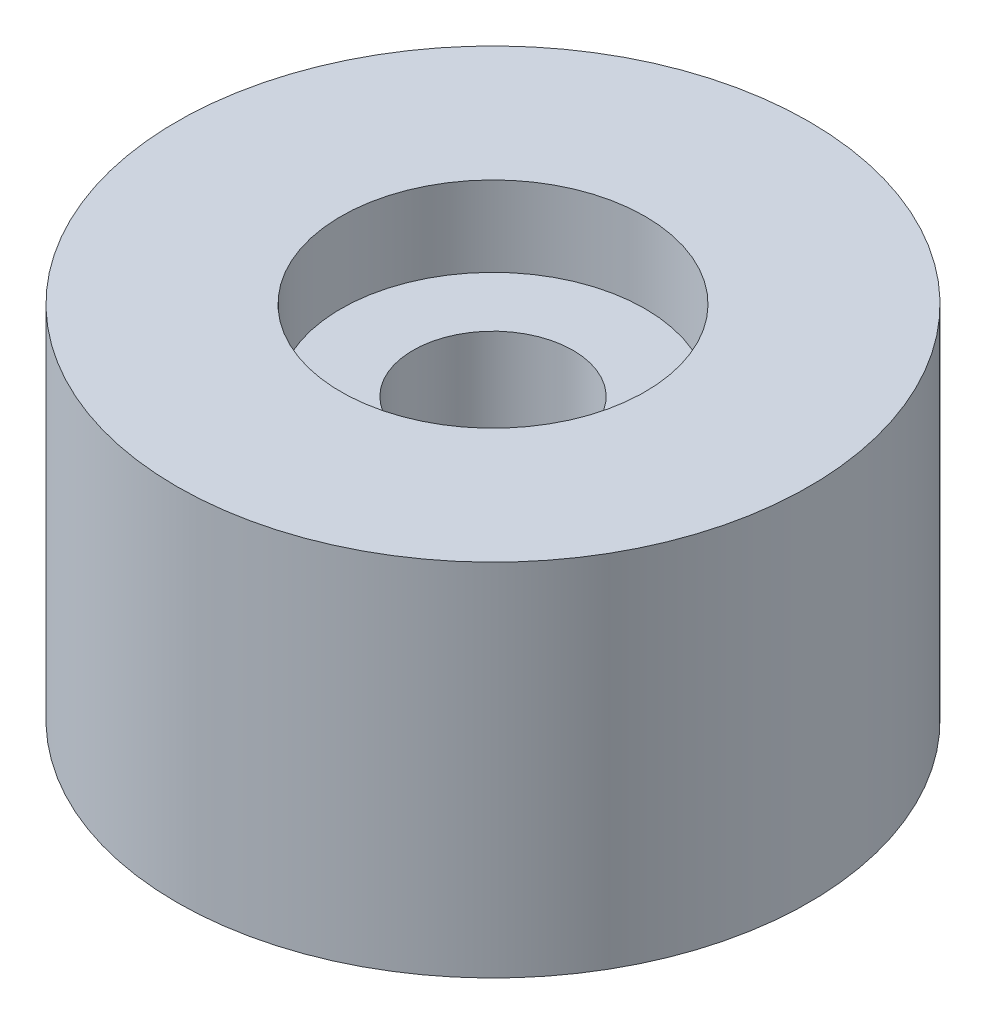
ISO-10303-21;
HEADER;
FILE_DESCRIPTION(('STEP AP214'),'2;1');
FILE_NAME('part.step','',(''),(''),'','','');
FILE_SCHEMA(('AUTOMOTIVE_DESIGN { 1 0 10303 214 1 1 1 1 }'));
ENDSEC;
DATA;
#1=APPLICATION_CONTEXT('core data for automotive mechanical design processes');
#2=APPLICATION_PROTOCOL_DEFINITION('international standard','automotive_design',2000,#1);
#3=PRODUCT_CONTEXT('',#1,'mechanical');
#4=PRODUCT('Part','Part','',(#3));
#5=PRODUCT_RELATED_PRODUCT_CATEGORY('part','',(#4));
#6=PRODUCT_DEFINITION_FORMATION('','',#4);
#7=PRODUCT_DEFINITION_CONTEXT('part definition',#1,'design');
#8=PRODUCT_DEFINITION('design','',#6,#7);
#9=PRODUCT_DEFINITION_SHAPE('','',#8);
#10=(LENGTH_UNIT() NAMED_UNIT(*) SI_UNIT(.MILLI.,.METRE.));
#11=(NAMED_UNIT(*) PLANE_ANGLE_UNIT() SI_UNIT($,.RADIAN.));
#12=(NAMED_UNIT(*) SI_UNIT($,.STERADIAN.) SOLID_ANGLE_UNIT());
#13=UNCERTAINTY_MEASURE_WITH_UNIT(LENGTH_MEASURE(1.E-05),#10,'distance_accuracy_value','');
#14=(GEOMETRIC_REPRESENTATION_CONTEXT(3) GLOBAL_UNCERTAINTY_ASSIGNED_CONTEXT((#13)) GLOBAL_UNIT_ASSIGNED_CONTEXT((#10,
#11,#12)) REPRESENTATION_CONTEXT('',''));
#15=CARTESIAN_POINT('',(0.,0.,0.));
#16=DIRECTION('',(0.,0.,1.));
#17=DIRECTION('',(1.,0.,0.));
#18=AXIS2_PLACEMENT_3D('',#15,#16,#17);
#19=CARTESIAN_POINT('',(0.,11.43,0.));
#20=DIRECTION('',(0.,-1.,0.));
#21=DIRECTION('',(0.,0.,1.));
#22=AXIS2_PLACEMENT_3D('',#19,#20,#21);
#23=CYLINDRICAL_SURFACE('',#22,10.033);
#24=CARTESIAN_POINT('',(0.,11.43,0.));
#25=DIRECTION('',(0.,-1.,0.));
#26=DIRECTION('',(0.,0.,-1.));
#27=AXIS2_PLACEMENT_3D('',#24,#25,#26);
#28=CIRCLE('',#27,10.033);
#29=CARTESIAN_POINT('',(0.,11.43,-10.033));
#30=VERTEX_POINT('',#29);
#31=EDGE_CURVE('E10',#30,#30,#28,.T.);
#32=ORIENTED_EDGE('',*,*,#31,.T.);
#33=EDGE_LOOP('',(#32));
#34=FACE_BOUND('',#33,.T.);
#35=CARTESIAN_POINT('',(0.,0.,0.));
#36=DIRECTION('',(0.,-1.,0.));
#37=DIRECTION('',(0.,0.,-1.));
#38=AXIS2_PLACEMENT_3D('',#35,#36,#37);
#39=CIRCLE('',#38,10.033);
#40=CARTESIAN_POINT('',(0.,0.,-10.033));
#41=VERTEX_POINT('',#40);
#42=EDGE_CURVE('E38',#41,#41,#39,.T.);
#43=ORIENTED_EDGE('',*,*,#42,.F.);
#44=EDGE_LOOP('',(#43));
#45=FACE_BOUND('',#44,.T.);
#46=ADVANCED_FACE('F35',(#34,#45),#23,.T.);
#47=CARTESIAN_POINT('',(0.,11.43,0.));
#48=DIRECTION('',(0.,1.,0.));
#49=DIRECTION('',(0.,0.,-1.));
#50=AXIS2_PLACEMENT_3D('',#47,#48,#49);
#51=PLANE('',#50);
#52=CARTESIAN_POINT('',(0.,11.43,0.));
#53=DIRECTION('',(0.,-1.,0.));
#54=DIRECTION('',(0.,0.,-1.));
#55=AXIS2_PLACEMENT_3D('',#52,#53,#54);
#56=CIRCLE('',#55,4.826);
#57=CARTESIAN_POINT('',(0.,11.43,-4.826));
#58=VERTEX_POINT('',#57);
#59=EDGE_CURVE('E61',#58,#58,#56,.T.);
#60=ORIENTED_EDGE('',*,*,#59,.T.);
#61=EDGE_LOOP('',(#60));
#62=FACE_BOUND('',#61,.T.);
#63=ORIENTED_EDGE('',*,*,#31,.F.);
#64=EDGE_LOOP('',(#63));
#65=FACE_BOUND('',#64,.T.);
#66=ADVANCED_FACE('F65',(#62,#65),#51,.T.);
#67=CARTESIAN_POINT('',(0.,0.,0.));
#68=DIRECTION('',(0.,1.,0.));
#69=DIRECTION('',(0.,0.,-1.));
#70=AXIS2_PLACEMENT_3D('',#67,#68,#69);
#71=PLANE('',#70);
#72=CARTESIAN_POINT('',(0.,0.,0.));
#73=DIRECTION('',(0.,-1.,0.));
#74=DIRECTION('',(0.,0.,-1.));
#75=AXIS2_PLACEMENT_3D('',#72,#73,#74);
#76=CIRCLE('',#75,4.826);
#77=CARTESIAN_POINT('',(0.,0.,-4.826));
#78=VERTEX_POINT('',#77);
#79=EDGE_CURVE('E45',#78,#78,#76,.T.);
#80=ORIENTED_EDGE('',*,*,#79,.F.);
#81=EDGE_LOOP('',(#80));
#82=FACE_BOUND('',#81,.T.);
#83=ORIENTED_EDGE('',*,*,#42,.T.);
#84=EDGE_LOOP('',(#83));
#85=FACE_BOUND('',#84,.T.);
#86=ADVANCED_FACE('F95',(#82,#85),#71,.F.);
#87=CARTESIAN_POINT('',(0.,11.43,0.));
#88=DIRECTION('',(0.,1.,0.));
#89=DIRECTION('',(0.,0.,-1.));
#90=AXIS2_PLACEMENT_3D('',#87,#88,#89);
#91=CYLINDRICAL_SURFACE('',#90,4.826);
#92=CARTESIAN_POINT('',(0.,2.54,0.));
#93=DIRECTION('',(0.,-1.,0.));
#94=DIRECTION('',(0.,0.,-1.));
#95=AXIS2_PLACEMENT_3D('',#92,#93,#94);
#96=CIRCLE('',#95,4.826);
#97=CARTESIAN_POINT('',(0.,2.54,-4.826));
#98=VERTEX_POINT('',#97);
#99=EDGE_CURVE('E49',#98,#98,#96,.T.);
#100=ORIENTED_EDGE('',*,*,#99,.F.);
#101=EDGE_LOOP('',(#100));
#102=FACE_BOUND('',#101,.T.);
#103=ORIENTED_EDGE('',*,*,#79,.T.);
#104=EDGE_LOOP('',(#103));
#105=FACE_BOUND('',#104,.T.);
#106=ADVANCED_FACE('F89',(#102,#105),#91,.F.);
#107=CARTESIAN_POINT('',(4.826,2.54,0.));
#108=DIRECTION('',(0.,-1.,0.));
#109=DIRECTION('',(0.,0.,1.));
#110=AXIS2_PLACEMENT_3D('',#107,#108,#109);
#111=PLANE('',#110);
#112=CARTESIAN_POINT('',(0.,2.54,0.));
#113=DIRECTION('',(0.,-1.,0.));
#114=DIRECTION('',(0.,0.,-1.));
#115=AXIS2_PLACEMENT_3D('',#112,#113,#114);
#116=CIRCLE('',#115,2.54);
#117=CARTESIAN_POINT('',(0.,2.54,-2.54));
#118=VERTEX_POINT('',#117);
#119=EDGE_CURVE('E52',#118,#118,#116,.T.);
#120=ORIENTED_EDGE('',*,*,#119,.F.);
#121=EDGE_LOOP('',(#120));
#122=FACE_BOUND('',#121,.T.);
#123=ORIENTED_EDGE('',*,*,#99,.T.);
#124=EDGE_LOOP('',(#123));
#125=FACE_BOUND('',#124,.T.);
#126=ADVANCED_FACE('F83',(#122,#125),#111,.T.);
#127=CARTESIAN_POINT('',(0.,11.43,0.));
#128=DIRECTION('',(0.,1.,0.));
#129=DIRECTION('',(0.,0.,-1.));
#130=AXIS2_PLACEMENT_3D('',#127,#128,#129);
#131=CYLINDRICAL_SURFACE('',#130,2.54);
#132=CARTESIAN_POINT('',(0.,8.89,0.));
#133=DIRECTION('',(0.,-1.,0.));
#134=DIRECTION('',(0.,0.,-1.));
#135=AXIS2_PLACEMENT_3D('',#132,#133,#134);
#136=CIRCLE('',#135,2.54);
#137=CARTESIAN_POINT('',(0.,8.89,-2.54));
#138=VERTEX_POINT('',#137);
#139=EDGE_CURVE('E55',#138,#138,#136,.T.);
#140=ORIENTED_EDGE('',*,*,#139,.F.);
#141=EDGE_LOOP('',(#140));
#142=FACE_BOUND('',#141,.T.);
#143=ORIENTED_EDGE('',*,*,#119,.T.);
#144=EDGE_LOOP('',(#143));
#145=FACE_BOUND('',#144,.T.);
#146=ADVANCED_FACE('F77',(#142,#145),#131,.F.);
#147=CARTESIAN_POINT('',(2.54,8.89,0.));
#148=DIRECTION('',(0.,1.,0.));
#149=DIRECTION('',(0.,0.,-1.));
#150=AXIS2_PLACEMENT_3D('',#147,#148,#149);
#151=PLANE('',#150);
#152=CARTESIAN_POINT('',(0.,8.89,0.));
#153=DIRECTION('',(0.,-1.,0.));
#154=DIRECTION('',(0.,0.,-1.));
#155=AXIS2_PLACEMENT_3D('',#152,#153,#154);
#156=CIRCLE('',#155,4.826);
#157=CARTESIAN_POINT('',(0.,8.89,-4.826));
#158=VERTEX_POINT('',#157);
#159=EDGE_CURVE('E58',#158,#158,#156,.T.);
#160=ORIENTED_EDGE('',*,*,#159,.F.);
#161=EDGE_LOOP('',(#160));
#162=FACE_BOUND('',#161,.T.);
#163=ORIENTED_EDGE('',*,*,#139,.T.);
#164=EDGE_LOOP('',(#163));
#165=FACE_BOUND('',#164,.T.);
#166=ADVANCED_FACE('F71',(#162,#165),#151,.T.);
#167=CARTESIAN_POINT('',(0.,11.43,0.));
#168=DIRECTION('',(0.,1.,0.));
#169=DIRECTION('',(0.,0.,-1.));
#170=AXIS2_PLACEMENT_3D('',#167,#168,#169);
#171=CYLINDRICAL_SURFACE('',#170,4.826);
#172=ORIENTED_EDGE('',*,*,#59,.F.);
#173=EDGE_LOOP('',(#172));
#174=FACE_BOUND('',#173,.T.);
#175=ORIENTED_EDGE('',*,*,#159,.T.);
#176=EDGE_LOOP('',(#175));
#177=FACE_BOUND('',#176,.T.);
#178=ADVANCED_FACE('F68',(#174,#177),#171,.F.);
#179=CLOSED_SHELL('',(#46,#66,#86,#106,#126,#146,#166,#178));
#180=MANIFOLD_SOLID_BREP('B2',#179);
#181=ADVANCED_BREP_SHAPE_REPRESENTATION('',(#18,#180),#14);
#182=SHAPE_DEFINITION_REPRESENTATION(#9,#181);
ENDSEC;
END-ISO-10303-21;
